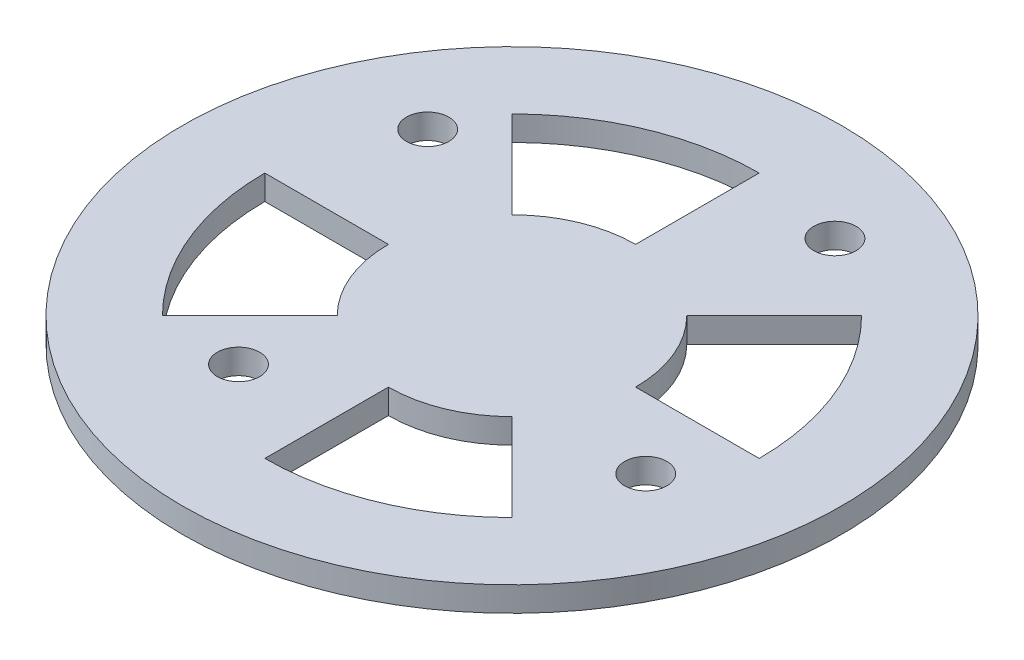
ISO-10303-21;
HEADER;
FILE_DESCRIPTION(('STEP AP214'),'2;1');
FILE_NAME('part.step','',(''),(''),'','','');
FILE_SCHEMA(('AUTOMOTIVE_DESIGN { 1 0 10303 214 1 1 1 1 }'));
ENDSEC;
DATA;
#1=APPLICATION_CONTEXT('core data for automotive mechanical design processes');
#2=APPLICATION_PROTOCOL_DEFINITION('international standard','automotive_design',2000,#1);
#3=PRODUCT_CONTEXT('',#1,'mechanical');
#4=PRODUCT('Part','Part','',(#3));
#5=PRODUCT_RELATED_PRODUCT_CATEGORY('part','',(#4));
#6=PRODUCT_DEFINITION_FORMATION('','',#4);
#7=PRODUCT_DEFINITION_CONTEXT('part definition',#1,'design');
#8=PRODUCT_DEFINITION('design','',#6,#7);
#9=PRODUCT_DEFINITION_SHAPE('','',#8);
#10=(LENGTH_UNIT() NAMED_UNIT(*) SI_UNIT(.MILLI.,.METRE.));
#11=(NAMED_UNIT(*) PLANE_ANGLE_UNIT() SI_UNIT($,.RADIAN.));
#12=(NAMED_UNIT(*) SI_UNIT($,.STERADIAN.) SOLID_ANGLE_UNIT());
#13=UNCERTAINTY_MEASURE_WITH_UNIT(LENGTH_MEASURE(1.E-05),#10,'distance_accuracy_value','');
#14=(GEOMETRIC_REPRESENTATION_CONTEXT(3) GLOBAL_UNCERTAINTY_ASSIGNED_CONTEXT((#13)) GLOBAL_UNIT_ASSIGNED_CONTEXT((#10,
#11,#12)) REPRESENTATION_CONTEXT('',''));
#15=CARTESIAN_POINT('',(0.,0.,0.));
#16=DIRECTION('',(0.,0.,1.));
#17=DIRECTION('',(1.,0.,0.));
#18=AXIS2_PLACEMENT_3D('',#15,#16,#17);
#19=CARTESIAN_POINT('',(0.,0.,0.));
#20=DIRECTION('',(0.,1.,0.));
#21=DIRECTION('',(0.,0.,1.));
#22=AXIS2_PLACEMENT_3D('',#19,#20,#21);
#23=PLANE('',#22);
#24=CARTESIAN_POINT('',(14.5802387731097,0.,-35.1998101886801));
#25=DIRECTION('',(0.,1.,0.));
#26=DIRECTION('',(0.,0.,1.));
#27=AXIS2_PLACEMENT_3D('',#24,#25,#26);
#28=CIRCLE('',#27,3.2639);
#29=CARTESIAN_POINT('',(14.5802387731097,0.,-31.9359101886801));
#30=VERTEX_POINT('',#29);
#31=EDGE_CURVE('E249',#30,#30,#28,.T.);
#32=ORIENTED_EDGE('',*,*,#31,.T.);
#33=EDGE_LOOP('',(#32));
#34=FACE_BOUND('',#33,.T.);
#35=CARTESIAN_POINT('',(31.3898101886813,0.,10.7702387731094));
#36=DIRECTION('',(0.,1.,0.));
#37=DIRECTION('',(0.,0.,1.));
#38=AXIS2_PLACEMENT_3D('',#35,#36,#37);
#39=CIRCLE('',#38,3.2639);
#40=CARTESIAN_POINT('',(31.3898101886813,0.,14.0341387731094));
#41=VERTEX_POINT('',#40);
#42=EDGE_CURVE('E262',#41,#41,#39,.T.);
#43=ORIENTED_EDGE('',*,*,#42,.T.);
#44=EDGE_LOOP('',(#43));
#45=FACE_BOUND('',#44,.T.);
#46=CARTESIAN_POINT('',(-14.5802387731082,0.,27.5798101886808));
#47=DIRECTION('',(0.,1.,0.));
#48=DIRECTION('',(0.,0.,1.));
#49=AXIS2_PLACEMENT_3D('',#46,#47,#48);
#50=CIRCLE('',#49,3.2639);
#51=CARTESIAN_POINT('',(-14.5802387731082,0.,30.8437101886808));
#52=VERTEX_POINT('',#51);
#53=EDGE_CURVE('E270',#52,#52,#50,.T.);
#54=ORIENTED_EDGE('',*,*,#53,.T.);
#55=EDGE_LOOP('',(#54));
#56=FACE_BOUND('',#55,.T.);
#57=CARTESIAN_POINT('',(-31.3898101886795,0.,-18.3902387731088));
#58=DIRECTION('',(0.,1.,0.));
#59=DIRECTION('',(0.,0.,1.));
#60=AXIS2_PLACEMENT_3D('',#57,#58,#59);
#61=CIRCLE('',#60,3.2639);
#62=CARTESIAN_POINT('',(-31.3898101886795,0.,-15.1263387731088));
#63=VERTEX_POINT('',#62);
#64=EDGE_CURVE('E238',#63,#63,#61,.T.);
#65=ORIENTED_EDGE('',*,*,#64,.T.);
#66=EDGE_LOOP('',(#65));
#67=FACE_BOUND('',#66,.T.);
#68=CARTESIAN_POINT('',(0.,0.,0.));
#69=DIRECTION('',(0.,1.,0.));
#70=DIRECTION('',(0.,0.,1.));
#71=AXIS2_PLACEMENT_3D('',#68,#69,#70);
#72=CIRCLE('',#71,19.05);
#73=CARTESIAN_POINT('',(-1.33025439009923E-13,0.,19.05));
#74=VERTEX_POINT('',#73);
#75=CARTESIAN_POINT('',(13.4703841816037,0.,13.4703841816038));
#76=VERTEX_POINT('',#75);
#77=EDGE_CURVE('E307',#74,#76,#72,.T.);
#78=ORIENTED_EDGE('',*,*,#77,.F.);
#79=DIRECTION('',(0.,0.,1.));
#80=VECTOR('',#79,1.);
#81=CARTESIAN_POINT('',(0.,0.,0.));
#82=LINE('',#81,#80);
#83=CARTESIAN_POINT('',(-2.66050878019847E-13,0.,38.1));
#84=VERTEX_POINT('',#83);
#85=EDGE_CURVE('E310',#74,#84,#82,.T.);
#86=ORIENTED_EDGE('',*,*,#85,.T.);
#87=CARTESIAN_POINT('',(0.,0.,0.));
#88=DIRECTION('',(0.,1.,0.));
#89=DIRECTION('',(0.,0.,1.));
#90=AXIS2_PLACEMENT_3D('',#87,#88,#89);
#91=CIRCLE('',#90,38.1);
#92=CARTESIAN_POINT('',(26.9407683632073,0.,26.9407683632076));
#93=VERTEX_POINT('',#92);
#94=EDGE_CURVE('E314',#84,#93,#91,.T.);
#95=ORIENTED_EDGE('',*,*,#94,.T.);
#96=DIRECTION('',(0.707106781186544,0.,0.707106781186551));
#97=VECTOR('',#96,1.);
#98=CARTESIAN_POINT('',(0.,0.,0.));
#99=LINE('',#98,#97);
#100=EDGE_CURVE('E318',#76,#93,#99,.T.);
#101=ORIENTED_EDGE('',*,*,#100,.F.);
#102=EDGE_LOOP('',(#78,#86,#95,#101));
#103=FACE_BOUND('',#102,.T.);
#104=CARTESIAN_POINT('',(0.,0.,0.));
#105=DIRECTION('',(0.,1.,0.));
#106=DIRECTION('',(0.,0.,1.));
#107=AXIS2_PLACEMENT_3D('',#104,#105,#106);
#108=CIRCLE('',#107,19.05);
#109=CARTESIAN_POINT('',(0.,0.,-19.05));
#110=VERTEX_POINT('',#109);
#111=CARTESIAN_POINT('',(-13.4703841816036,0.,-13.4703841816039));
#112=VERTEX_POINT('',#111);
#113=EDGE_CURVE('E197',#110,#112,#108,.T.);
#114=ORIENTED_EDGE('',*,*,#113,.F.);
#115=DIRECTION('',(0.,0.,-1.));
#116=VECTOR('',#115,1.);
#117=CARTESIAN_POINT('',(0.,0.,0.));
#118=LINE('',#117,#116);
#119=CARTESIAN_POINT('',(0.,0.,-38.1));
#120=VERTEX_POINT('',#119);
#121=EDGE_CURVE('E200',#110,#120,#118,.T.);
#122=ORIENTED_EDGE('',*,*,#121,.T.);
#123=CARTESIAN_POINT('',(0.,0.,0.));
#124=DIRECTION('',(0.,1.,0.));
#125=DIRECTION('',(0.,0.,1.));
#126=AXIS2_PLACEMENT_3D('',#123,#124,#125);
#127=CIRCLE('',#126,38.1);
#128=CARTESIAN_POINT('',(-26.9407683632071,0.,-26.9407683632078));
#129=VERTEX_POINT('',#128);
#130=EDGE_CURVE('E205',#120,#129,#127,.T.);
#131=ORIENTED_EDGE('',*,*,#130,.T.);
#132=DIRECTION('',(-0.707106781186539,0.,-0.707106781186556));
#133=VECTOR('',#132,1.);
#134=CARTESIAN_POINT('',(0.,0.,0.));
#135=LINE('',#134,#133);
#136=EDGE_CURVE('E209',#112,#129,#135,.T.);
#137=ORIENTED_EDGE('',*,*,#136,.F.);
#138=EDGE_LOOP('',(#114,#122,#131,#137));
#139=FACE_BOUND('',#138,.T.);
#140=CARTESIAN_POINT('',(0.,0.,0.));
#141=DIRECTION('',(0.,1.,0.));
#142=DIRECTION('',(0.,0.,1.));
#143=AXIS2_PLACEMENT_3D('',#140,#141,#142);
#144=CIRCLE('',#143,50.8);
#145=CARTESIAN_POINT('',(0.,0.,-50.8));
#146=VERTEX_POINT('',#145);
#147=EDGE_CURVE('E11',#146,#146,#144,.T.);
#148=ORIENTED_EDGE('',*,*,#147,.F.);
#149=EDGE_LOOP('',(#148));
#150=FACE_BOUND('',#149,.T.);
#151=CARTESIAN_POINT('',(0.,0.,0.));
#152=DIRECTION('',(0.,1.,0.));
#153=DIRECTION('',(0.,0.,1.));
#154=AXIS2_PLACEMENT_3D('',#151,#152,#153);
#155=CIRCLE('',#154,19.05);
#156=CARTESIAN_POINT('',(19.05,0.,0.));
#157=VERTEX_POINT('',#156);
#158=CARTESIAN_POINT('',(13.4703841816038,0.,-13.4703841816037));
#159=VERTEX_POINT('',#158);
#160=EDGE_CURVE('E277',#157,#159,#155,.T.);
#161=ORIENTED_EDGE('',*,*,#160,.F.);
#162=DIRECTION('',(1.,0.,0.));
#163=VECTOR('',#162,1.);
#164=CARTESIAN_POINT('',(0.,0.,0.));
#165=LINE('',#164,#163);
#166=CARTESIAN_POINT('',(38.1,0.,1.33025439009923E-13));
#167=VERTEX_POINT('',#166);
#168=EDGE_CURVE('E280',#157,#167,#165,.T.);
#169=ORIENTED_EDGE('',*,*,#168,.T.);
#170=CARTESIAN_POINT('',(0.,0.,0.));
#171=DIRECTION('',(0.,1.,0.));
#172=DIRECTION('',(0.,0.,1.));
#173=AXIS2_PLACEMENT_3D('',#170,#171,#172);
#174=CIRCLE('',#173,38.1);
#175=CARTESIAN_POINT('',(26.9407683632075,0.,-26.9407683632074));
#176=VERTEX_POINT('',#175);
#177=EDGE_CURVE('E285',#167,#176,#174,.T.);
#178=ORIENTED_EDGE('',*,*,#177,.T.);
#179=DIRECTION('',(0.707106781186549,0.,-0.707106781186546));
#180=VECTOR('',#179,1.);
#181=CARTESIAN_POINT('',(0.,0.,0.));
#182=LINE('',#181,#180);
#183=EDGE_CURVE('E289',#159,#176,#182,.T.);
#184=ORIENTED_EDGE('',*,*,#183,.F.);
#185=EDGE_LOOP('',(#161,#169,#178,#184));
#186=FACE_BOUND('',#185,.T.);
#187=CARTESIAN_POINT('',(0.,0.,0.));
#188=DIRECTION('',(0.,1.,0.));
#189=DIRECTION('',(0.,0.,1.));
#190=AXIS2_PLACEMENT_3D('',#187,#188,#189);
#191=CIRCLE('',#190,19.05);
#192=CARTESIAN_POINT('',(-19.05,0.,-1.99538158514885E-13));
#193=VERTEX_POINT('',#192);
#194=CARTESIAN_POINT('',(-13.4703841816038,0.,13.4703841816036));
#195=VERTEX_POINT('',#194);
#196=EDGE_CURVE('E253',#193,#195,#191,.T.);
#197=ORIENTED_EDGE('',*,*,#196,.F.);
#198=DIRECTION('',(-1.,0.,0.));
#199=VECTOR('',#198,1.);
#200=CARTESIAN_POINT('',(0.,0.,0.));
#201=LINE('',#200,#199);
#202=CARTESIAN_POINT('',(-38.1,0.,-3.9907631702977E-13));
#203=VERTEX_POINT('',#202);
#204=EDGE_CURVE('E183',#193,#203,#201,.T.);
#205=ORIENTED_EDGE('',*,*,#204,.T.);
#206=CARTESIAN_POINT('',(0.,0.,0.));
#207=DIRECTION('',(0.,1.,0.));
#208=DIRECTION('',(0.,0.,1.));
#209=AXIS2_PLACEMENT_3D('',#206,#207,#208);
#210=CIRCLE('',#209,38.1);
#211=CARTESIAN_POINT('',(-26.9407683632077,0.,26.9407683632072));
#212=VERTEX_POINT('',#211);
#213=EDGE_CURVE('E193',#203,#212,#210,.T.);
#214=ORIENTED_EDGE('',*,*,#213,.T.);
#215=DIRECTION('',(-0.707106781186554,0.,0.707106781186541));
#216=VECTOR('',#215,1.);
#217=CARTESIAN_POINT('',(0.,0.,0.));
#218=LINE('',#217,#216);
#219=EDGE_CURVE('E187',#195,#212,#218,.T.);
#220=ORIENTED_EDGE('',*,*,#219,.F.);
#221=EDGE_LOOP('',(#197,#205,#214,#220));
#222=FACE_BOUND('',#221,.T.);
#223=ADVANCED_FACE('F43',(#34,#45,#56,#67,#103,#139,#150,#186,#222),#23,.F.);
#224=CARTESIAN_POINT('',(0.,19.05,0.));
#225=DIRECTION('',(0.,-1.,0.));
#226=DIRECTION('',(0.,0.,-1.));
#227=AXIS2_PLACEMENT_3D('',#224,#225,#226);
#228=CYLINDRICAL_SURFACE('',#227,50.8);
#229=CARTESIAN_POINT('',(0.,3.81000000000001,0.));
#230=DIRECTION('',(0.,-1.,0.));
#231=DIRECTION('',(0.,0.,-1.));
#232=AXIS2_PLACEMENT_3D('',#229,#230,#231);
#233=CIRCLE('',#232,50.8);
#234=CARTESIAN_POINT('',(0.,3.81000000000001,-50.8));
#235=VERTEX_POINT('',#234);
#236=EDGE_CURVE('E168',#235,#235,#233,.F.);
#237=CARTESIAN_POINT('',(0.,3.81000000000001,-50.8));
#238=CARTESIAN_POINT('',(0.,3.77031250000001,-50.8));
#239=CARTESIAN_POINT('',(0.,3.73062500000001,-50.8));
#240=CARTESIAN_POINT('',(0.,3.65125000000001,-50.8));
#241=CARTESIAN_POINT('',(0.,3.61156250000001,-50.8));
#242=CARTESIAN_POINT('',(0.,3.53218750000001,-50.8));
#243=CARTESIAN_POINT('',(0.,3.49250000000001,-50.8));
#244=CARTESIAN_POINT('',(0.,3.41312500000001,-50.8));
#245=CARTESIAN_POINT('',(0.,3.37343750000001,-50.8));
#246=CARTESIAN_POINT('',(0.,3.29406250000001,-50.8));
#247=CARTESIAN_POINT('',(0.,3.25437500000001,-50.8));
#248=CARTESIAN_POINT('',(0.,3.17500000000001,-50.8));
#249=CARTESIAN_POINT('',(0.,3.13531250000001,-50.8));
#250=CARTESIAN_POINT('',(0.,3.05593750000001,-50.8));
#251=CARTESIAN_POINT('',(0.,3.01625000000001,-50.8));
#252=CARTESIAN_POINT('',(0.,2.93687500000001,-50.8));
#253=CARTESIAN_POINT('',(0.,2.89718750000001,-50.8));
#254=CARTESIAN_POINT('',(0.,2.81781250000001,-50.8));
#255=CARTESIAN_POINT('',(0.,2.77812500000001,-50.8));
#256=CARTESIAN_POINT('',(0.,2.69875000000001,-50.8));
#257=CARTESIAN_POINT('',(0.,2.65906250000001,-50.8));
#258=CARTESIAN_POINT('',(0.,2.57968750000001,-50.8));
#259=CARTESIAN_POINT('',(0.,2.54000000000001,-50.8));
#260=CARTESIAN_POINT('',(0.,2.46062500000001,-50.8));
#261=CARTESIAN_POINT('',(0.,2.42093750000001,-50.8));
#262=CARTESIAN_POINT('',(0.,2.34156250000001,-50.8));
#263=CARTESIAN_POINT('',(0.,2.30187500000001,-50.8));
#264=CARTESIAN_POINT('',(0.,2.22250000000001,-50.8));
#265=CARTESIAN_POINT('',(0.,2.18281250000001,-50.8));
#266=CARTESIAN_POINT('',(0.,2.10343750000001,-50.8));
#267=CARTESIAN_POINT('',(0.,2.06375000000001,-50.8));
#268=CARTESIAN_POINT('',(0.,1.98437500000001,-50.8));
#269=CARTESIAN_POINT('',(0.,1.9446875,-50.8));
#270=CARTESIAN_POINT('',(0.,1.8653125,-50.8));
#271=CARTESIAN_POINT('',(0.,1.825625,-50.8));
#272=CARTESIAN_POINT('',(0.,1.74625,-50.8));
#273=CARTESIAN_POINT('',(0.,1.7065625,-50.8));
#274=CARTESIAN_POINT('',(0.,1.62718750000001,-50.8));
#275=CARTESIAN_POINT('',(0.,1.58750000000001,-50.8));
#276=CARTESIAN_POINT('',(0.,1.508125,-50.8));
#277=CARTESIAN_POINT('',(0.,1.4684375,-50.8));
#278=CARTESIAN_POINT('',(0.,1.3890625,-50.8));
#279=CARTESIAN_POINT('',(0.,1.349375,-50.8));
#280=CARTESIAN_POINT('',(0.,1.27,-50.8));
#281=CARTESIAN_POINT('',(0.,1.2303125,-50.8));
#282=CARTESIAN_POINT('',(0.,1.1509375,-50.8));
#283=CARTESIAN_POINT('',(0.,1.11125,-50.8));
#284=CARTESIAN_POINT('',(0.,1.031875,-50.8));
#285=CARTESIAN_POINT('',(0.,0.992187500000003,-50.8));
#286=CARTESIAN_POINT('',(0.,0.912812500000002,-50.8));
#287=CARTESIAN_POINT('',(0.,0.873125000000002,-50.8));
#288=CARTESIAN_POINT('',(0.,0.793750000000003,-50.8));
#289=CARTESIAN_POINT('',(0.,0.754062500000003,-50.8));
#290=CARTESIAN_POINT('',(0.,0.674687500000002,-50.8));
#291=CARTESIAN_POINT('',(0.,0.635000000000001,-50.8));
#292=CARTESIAN_POINT('',(0.,0.555625000000001,-50.8));
#293=CARTESIAN_POINT('',(0.,0.515937500000001,-50.8));
#294=CARTESIAN_POINT('',(0.,0.436562500000001,-50.8));
#295=CARTESIAN_POINT('',(0.,0.396875000000001,-50.8));
#296=CARTESIAN_POINT('',(0.,0.317500000000001,-50.8));
#297=CARTESIAN_POINT('',(0.,0.2778125,-50.8));
#298=CARTESIAN_POINT('',(0.,0.198437499999999,-50.8));
#299=CARTESIAN_POINT('',(0.,0.158749999999999,-50.8));
#300=CARTESIAN_POINT('',(0.,0.0793749999999996,-50.8));
#301=CARTESIAN_POINT('',(0.,0.0396874999999998,-50.8));
#302=CARTESIAN_POINT('',(0.,0.,-50.8));
#303=B_SPLINE_CURVE_WITH_KNOTS('',3,(#237,#238,#239,#240,#241,#242,#243,#244,#245,#246,#247,
#248,#249,#250,#251,#252,#253,#254,#255,#256,#257,#258,#259,#260,#261,#262,#263,#264,#265,#266,
#267,#268,#269,#270,#271,#272,#273,#274,#275,#276,#277,#278,#279,#280,#281,#282,#283,#284,#285,
#286,#287,#288,#289,#290,#291,#292,#293,#294,#295,#296,#297,#298,#299,#300,#301,#302),
.UNSPECIFIED.,.F.,.F.,(4,2,2,2,2,2,2,2,2,2,2,2,2,2,2,2,2,2,2,2,2,2,2,2,2,2,2,2,2,2,2,2,4),(0.,
0.119062500000001,0.238125,0.357187500000002,0.476249999999999,0.595312499999999,
0.714375000000001,0.833437500000001,0.9525,1.0715625,1.190625,1.3096875,1.42875,1.5478125,
1.666875,1.7859375,1.90500000000001,2.02406250000001,2.143125,2.2621875,2.38125000000001,
2.50031250000001,2.61937500000001,2.7384375,2.85750000000001,2.97656250000001,3.09562500000001,
3.21468750000001,3.33375000000001,3.45281250000001,3.57187500000001,3.69093750000001,
3.81000000000001),.UNSPECIFIED.);
#304=EDGE_CURVE('BSEAM45',#235,#146,#303,.T.);
#305=ORIENTED_EDGE('',*,*,#236,.F.);
#306=ORIENTED_EDGE('',*,*,#147,.T.);
#307=ORIENTED_EDGE('',*,*,#304,.T.);
#308=ORIENTED_EDGE('',*,*,#304,.F.);
#309=EDGE_LOOP('',(#305,#307,#306,#308));
#310=FACE_BOUND('',#309,.T.);
#311=ADVANCED_FACE('F45',(#310),#228,.T.);
#312=CARTESIAN_POINT('',(0.,3.81,0.));
#313=DIRECTION('',(0.,-1.,0.));
#314=DIRECTION('',(0.,0.,-1.));
#315=AXIS2_PLACEMENT_3D('',#312,#313,#314);
#316=PLANE('',#315);
#317=CARTESIAN_POINT('',(14.5802387731097,3.81,-35.1998101886801));
#318=DIRECTION('',(0.,1.,0.));
#319=DIRECTION('',(0.,0.,1.));
#320=AXIS2_PLACEMENT_3D('',#317,#318,#319);
#321=CIRCLE('',#320,3.2639);
#322=CARTESIAN_POINT('',(14.5802387731097,3.81,-31.9359101886801));
#323=VERTEX_POINT('',#322);
#324=EDGE_CURVE('E254',#323,#323,#321,.T.);
#325=ORIENTED_EDGE('',*,*,#324,.F.);
#326=EDGE_LOOP('',(#325));
#327=FACE_BOUND('',#326,.T.);
#328=CARTESIAN_POINT('',(31.3898101886813,3.81,10.7702387731094));
#329=DIRECTION('',(0.,1.,0.));
#330=DIRECTION('',(0.,0.,1.));
#331=AXIS2_PLACEMENT_3D('',#328,#329,#330);
#332=CIRCLE('',#331,3.2639);
#333=CARTESIAN_POINT('',(31.3898101886813,3.81,14.0341387731094));
#334=VERTEX_POINT('',#333);
#335=EDGE_CURVE('E258',#334,#334,#332,.T.);
#336=ORIENTED_EDGE('',*,*,#335,.F.);
#337=EDGE_LOOP('',(#336));
#338=FACE_BOUND('',#337,.T.);
#339=CARTESIAN_POINT('',(-14.5802387731082,3.81,27.5798101886808));
#340=DIRECTION('',(0.,1.,0.));
#341=DIRECTION('',(0.,0.,1.));
#342=AXIS2_PLACEMENT_3D('',#339,#340,#341);
#343=CIRCLE('',#342,3.2639);
#344=CARTESIAN_POINT('',(-14.5802387731082,3.81,30.8437101886808));
#345=VERTEX_POINT('',#344);
#346=EDGE_CURVE('E266',#345,#345,#343,.T.);
#347=ORIENTED_EDGE('',*,*,#346,.F.);
#348=EDGE_LOOP('',(#347));
#349=FACE_BOUND('',#348,.T.);
#350=CARTESIAN_POINT('',(-31.3898101886795,3.81,-18.3902387731088));
#351=DIRECTION('',(0.,1.,0.));
#352=DIRECTION('',(0.,0.,1.));
#353=AXIS2_PLACEMENT_3D('',#350,#351,#352);
#354=CIRCLE('',#353,3.2639);
#355=CARTESIAN_POINT('',(-31.3898101886795,3.81,-15.1263387731088));
#356=VERTEX_POINT('',#355);
#357=EDGE_CURVE('E244',#356,#356,#354,.T.);
#358=ORIENTED_EDGE('',*,*,#357,.F.);
#359=EDGE_LOOP('',(#358));
#360=FACE_BOUND('',#359,.T.);
#361=ORIENTED_EDGE('',*,*,#236,.T.);
#362=EDGE_LOOP('',(#361));
#363=FACE_BOUND('',#362,.T.);
#364=CARTESIAN_POINT('',(0.,3.81,0.));
#365=DIRECTION('',(0.,-1.,0.));
#366=DIRECTION('',(0.,0.,-1.));
#367=AXIS2_PLACEMENT_3D('',#364,#365,#366);
#368=CIRCLE('',#367,19.05);
#369=CARTESIAN_POINT('',(-19.05,3.81,-1.99538158514885E-13));
#370=VERTEX_POINT('',#369);
#371=CARTESIAN_POINT('',(-13.4703841816038,3.81,13.4703841816036));
#372=VERTEX_POINT('',#371);
#373=EDGE_CURVE('E159',#370,#372,#368,.F.);
#374=ORIENTED_EDGE('',*,*,#373,.T.);
#375=DIRECTION('',(-0.707106781186554,0.,0.707106781186541));
#376=VECTOR('',#375,1.);
#377=CARTESIAN_POINT('',(0.,3.81,0.));
#378=LINE('',#377,#376);
#379=CARTESIAN_POINT('',(-26.9407683632077,3.81,26.9407683632072));
#380=VERTEX_POINT('',#379);
#381=EDGE_CURVE('E179',#372,#380,#378,.T.);
#382=ORIENTED_EDGE('',*,*,#381,.T.);
#383=CARTESIAN_POINT('',(0.,3.81,0.));
#384=DIRECTION('',(0.,-1.,0.));
#385=DIRECTION('',(0.,0.,-1.));
#386=AXIS2_PLACEMENT_3D('',#383,#384,#385);
#387=CIRCLE('',#386,38.1);
#388=CARTESIAN_POINT('',(-38.1,3.81,-3.9907631702977E-13));
#389=VERTEX_POINT('',#388);
#390=EDGE_CURVE('E162',#389,#380,#387,.F.);
#391=ORIENTED_EDGE('',*,*,#390,.F.);
#392=DIRECTION('',(-1.,0.,0.));
#393=VECTOR('',#392,1.);
#394=CARTESIAN_POINT('',(0.,3.81,0.));
#395=LINE('',#394,#393);
#396=EDGE_CURVE('E156',#370,#389,#395,.T.);
#397=ORIENTED_EDGE('',*,*,#396,.F.);
#398=EDGE_LOOP('',(#374,#382,#391,#397));
#399=FACE_BOUND('',#398,.T.);
#400=CARTESIAN_POINT('',(0.,3.81,0.));
#401=DIRECTION('',(0.,-1.,0.));
#402=DIRECTION('',(0.,0.,-1.));
#403=AXIS2_PLACEMENT_3D('',#400,#401,#402);
#404=CIRCLE('',#403,19.05);
#405=CARTESIAN_POINT('',(19.05,3.81,0.));
#406=VERTEX_POINT('',#405);
#407=CARTESIAN_POINT('',(13.4703841816038,3.81,-13.4703841816037));
#408=VERTEX_POINT('',#407);
#409=EDGE_CURVE('E473',#406,#408,#404,.F.);
#410=ORIENTED_EDGE('',*,*,#409,.T.);
#411=DIRECTION('',(0.707106781186549,0.,-0.707106781186546));
#412=VECTOR('',#411,1.);
#413=CARTESIAN_POINT('',(0.,3.81,0.));
#414=LINE('',#413,#412);
#415=CARTESIAN_POINT('',(26.9407683632075,3.81,-26.9407683632074));
#416=VERTEX_POINT('',#415);
#417=EDGE_CURVE('E470',#408,#416,#414,.T.);
#418=ORIENTED_EDGE('',*,*,#417,.T.);
#419=CARTESIAN_POINT('',(0.,3.81,0.));
#420=DIRECTION('',(0.,-1.,0.));
#421=DIRECTION('',(0.,0.,-1.));
#422=AXIS2_PLACEMENT_3D('',#419,#420,#421);
#423=CIRCLE('',#422,38.1);
#424=CARTESIAN_POINT('',(38.1,3.81,1.33025439009923E-13));
#425=VERTEX_POINT('',#424);
#426=EDGE_CURVE('E67',#425,#416,#423,.F.);
#427=ORIENTED_EDGE('',*,*,#426,.F.);
#428=DIRECTION('',(1.,0.,0.));
#429=VECTOR('',#428,1.);
#430=CARTESIAN_POINT('',(0.,3.81,0.));
#431=LINE('',#430,#429);
#432=EDGE_CURVE('E465',#406,#425,#431,.T.);
#433=ORIENTED_EDGE('',*,*,#432,.F.);
#434=EDGE_LOOP('',(#410,#418,#427,#433));
#435=FACE_BOUND('',#434,.T.);
#436=CARTESIAN_POINT('',(0.,3.81,0.));
#437=DIRECTION('',(0.,-1.,0.));
#438=DIRECTION('',(0.,0.,-1.));
#439=AXIS2_PLACEMENT_3D('',#436,#437,#438);
#440=CIRCLE('',#439,19.05);
#441=CARTESIAN_POINT('',(0.,3.81,-19.05));
#442=VERTEX_POINT('',#441);
#443=CARTESIAN_POINT('',(-13.4703841816036,3.81,-13.4703841816039));
#444=VERTEX_POINT('',#443);
#445=EDGE_CURVE('E235',#442,#444,#440,.F.);
#446=ORIENTED_EDGE('',*,*,#445,.T.);
#447=DIRECTION('',(-0.707106781186539,0.,-0.707106781186556));
#448=VECTOR('',#447,1.);
#449=CARTESIAN_POINT('',(0.,3.81,0.));
#450=LINE('',#449,#448);
#451=CARTESIAN_POINT('',(-26.9407683632071,3.81,-26.9407683632078));
#452=VERTEX_POINT('',#451);
#453=EDGE_CURVE('E239',#444,#452,#450,.T.);
#454=ORIENTED_EDGE('',*,*,#453,.T.);
#455=CARTESIAN_POINT('',(0.,3.81,0.));
#456=DIRECTION('',(0.,-1.,0.));
#457=DIRECTION('',(0.,0.,-1.));
#458=AXIS2_PLACEMENT_3D('',#455,#456,#457);
#459=CIRCLE('',#458,38.1);
#460=CARTESIAN_POINT('',(0.,3.81,-38.1));
#461=VERTEX_POINT('',#460);
#462=EDGE_CURVE('E59',#461,#452,#459,.F.);
#463=ORIENTED_EDGE('',*,*,#462,.F.);
#464=DIRECTION('',(0.,0.,-1.));
#465=VECTOR('',#464,1.);
#466=CARTESIAN_POINT('',(0.,3.81,0.));
#467=LINE('',#466,#465);
#468=EDGE_CURVE('E229',#442,#461,#467,.T.);
#469=ORIENTED_EDGE('',*,*,#468,.F.);
#470=EDGE_LOOP('',(#446,#454,#463,#469));
#471=FACE_BOUND('',#470,.T.);
#472=CARTESIAN_POINT('',(0.,3.81,0.));
#473=DIRECTION('',(0.,-1.,0.));
#474=DIRECTION('',(0.,0.,-1.));
#475=AXIS2_PLACEMENT_3D('',#472,#473,#474);
#476=CIRCLE('',#475,19.05);
#477=CARTESIAN_POINT('',(-1.33025439009923E-13,3.81,19.05));
#478=VERTEX_POINT('',#477);
#479=CARTESIAN_POINT('',(13.4703841816037,3.81,13.4703841816038));
#480=VERTEX_POINT('',#479);
#481=EDGE_CURVE('E462',#478,#480,#476,.F.);
#482=ORIENTED_EDGE('',*,*,#481,.T.);
#483=DIRECTION('',(0.707106781186544,0.,0.707106781186551));
#484=VECTOR('',#483,1.);
#485=CARTESIAN_POINT('',(0.,3.81,0.));
#486=LINE('',#485,#484);
#487=CARTESIAN_POINT('',(26.9407683632073,3.81,26.9407683632076));
#488=VERTEX_POINT('',#487);
#489=EDGE_CURVE('E459',#480,#488,#486,.T.);
#490=ORIENTED_EDGE('',*,*,#489,.T.);
#491=CARTESIAN_POINT('',(0.,3.81,0.));
#492=DIRECTION('',(0.,-1.,0.));
#493=DIRECTION('',(0.,0.,-1.));
#494=AXIS2_PLACEMENT_3D('',#491,#492,#493);
#495=CIRCLE('',#494,38.1);
#496=CARTESIAN_POINT('',(-2.66050878019847E-13,3.81,38.1));
#497=VERTEX_POINT('',#496);
#498=EDGE_CURVE('E455',#497,#488,#495,.F.);
#499=ORIENTED_EDGE('',*,*,#498,.F.);
#500=DIRECTION('',(0.,0.,1.));
#501=VECTOR('',#500,1.);
#502=CARTESIAN_POINT('',(0.,3.81,0.));
#503=LINE('',#502,#501);
#504=EDGE_CURVE('E178',#478,#497,#503,.T.);
#505=ORIENTED_EDGE('',*,*,#504,.F.);
#506=EDGE_LOOP('',(#482,#490,#499,#505));
#507=FACE_BOUND('',#506,.T.);
#508=ADVANCED_FACE('F158',(#327,#338,#349,#360,#363,#399,#435,#471,#507),#316,.F.);
#509=CARTESIAN_POINT('',(0.,0.,0.));
#510=DIRECTION('',(0.,1.,0.));
#511=DIRECTION('',(0.,0.,1.));
#512=AXIS2_PLACEMENT_3D('',#509,#510,#511);
#513=CYLINDRICAL_SURFACE('',#512,19.05);
#514=ORIENTED_EDGE('',*,*,#445,.F.);
#515=DIRECTION('',(0.,1.,0.));
#516=VECTOR('',#515,1.);
#517=CARTESIAN_POINT('',(0.,0.,-19.05));
#518=LINE('',#517,#516);
#519=EDGE_CURVE('E212',#110,#442,#518,.T.);
#520=ORIENTED_EDGE('',*,*,#519,.F.);
#521=ORIENTED_EDGE('',*,*,#113,.T.);
#522=DIRECTION('',(0.,1.,0.));
#523=VECTOR('',#522,1.);
#524=CARTESIAN_POINT('',(-13.4703841816036,0.,-13.4703841816039));
#525=LINE('',#524,#523);
#526=EDGE_CURVE('E52',#112,#444,#525,.T.);
#527=ORIENTED_EDGE('',*,*,#526,.T.);
#528=EDGE_LOOP('',(#514,#520,#521,#527));
#529=FACE_BOUND('',#528,.T.);
#530=ADVANCED_FACE('F233',(#529),#513,.T.);
#531=CARTESIAN_POINT('',(0.,0.,0.));
#532=DIRECTION('',(0.707106781186556,0.,-0.707106781186539));
#533=DIRECTION('',(-0.707106781186539,0.,-0.707106781186556));
#534=AXIS2_PLACEMENT_3D('',#531,#532,#533);
#535=PLANE('',#534);
#536=ORIENTED_EDGE('',*,*,#453,.F.);
#537=ORIENTED_EDGE('',*,*,#526,.F.);
#538=ORIENTED_EDGE('',*,*,#136,.T.);
#539=DIRECTION('',(0.,1.,0.));
#540=VECTOR('',#539,1.);
#541=CARTESIAN_POINT('',(-26.9407683632071,0.,-26.9407683632078));
#542=LINE('',#541,#540);
#543=EDGE_CURVE('E216',#129,#452,#542,.T.);
#544=ORIENTED_EDGE('',*,*,#543,.T.);
#545=EDGE_LOOP('',(#536,#537,#538,#544));
#546=FACE_BOUND('',#545,.T.);
#547=ADVANCED_FACE('F366',(#546),#535,.T.);
#548=CARTESIAN_POINT('',(0.,0.,0.));
#549=DIRECTION('',(0.,1.,0.));
#550=DIRECTION('',(0.,0.,1.));
#551=AXIS2_PLACEMENT_3D('',#548,#549,#550);
#552=CYLINDRICAL_SURFACE('',#551,38.1);
#553=DIRECTION('',(0.,1.,0.));
#554=VECTOR('',#553,1.);
#555=CARTESIAN_POINT('',(0.,0.,-38.1));
#556=LINE('',#555,#554);
#557=EDGE_CURVE('E220',#120,#461,#556,.T.);
#558=ORIENTED_EDGE('',*,*,#557,.T.);
#559=ORIENTED_EDGE('',*,*,#462,.T.);
#560=ORIENTED_EDGE('',*,*,#543,.F.);
#561=ORIENTED_EDGE('',*,*,#130,.F.);
#562=EDGE_LOOP('',(#558,#559,#560,#561));
#563=FACE_BOUND('',#562,.T.);
#564=ADVANCED_FACE('F370',(#563),#552,.F.);
#565=CARTESIAN_POINT('',(0.,0.,0.));
#566=DIRECTION('',(1.,0.,0.));
#567=DIRECTION('',(0.,0.,-1.));
#568=AXIS2_PLACEMENT_3D('',#565,#566,#567);
#569=PLANE('',#568);
#570=ORIENTED_EDGE('',*,*,#519,.T.);
#571=ORIENTED_EDGE('',*,*,#468,.T.);
#572=ORIENTED_EDGE('',*,*,#557,.F.);
#573=ORIENTED_EDGE('',*,*,#121,.F.);
#574=EDGE_LOOP('',(#570,#571,#572,#573));
#575=FACE_BOUND('',#574,.T.);
#576=ADVANCED_FACE('F227',(#575),#569,.F.);
#577=CARTESIAN_POINT('',(0.,0.,0.));
#578=DIRECTION('',(0.,1.,0.));
#579=DIRECTION('',(0.,0.,1.));
#580=AXIS2_PLACEMENT_3D('',#577,#578,#579);
#581=CYLINDRICAL_SURFACE('',#580,19.05);
#582=ORIENTED_EDGE('',*,*,#409,.F.);
#583=DIRECTION('',(0.,1.,0.));
#584=VECTOR('',#583,1.);
#585=CARTESIAN_POINT('',(19.05,0.,0.));
#586=LINE('',#585,#584);
#587=EDGE_CURVE('E292',#157,#406,#586,.T.);
#588=ORIENTED_EDGE('',*,*,#587,.F.);
#589=ORIENTED_EDGE('',*,*,#160,.T.);
#590=DIRECTION('',(0.,1.,0.));
#591=VECTOR('',#590,1.);
#592=CARTESIAN_POINT('',(13.4703841816038,0.,-13.4703841816037));
#593=LINE('',#592,#591);
#594=EDGE_CURVE('E201',#159,#408,#593,.T.);
#595=ORIENTED_EDGE('',*,*,#594,.T.);
#596=EDGE_LOOP('',(#582,#588,#589,#595));
#597=FACE_BOUND('',#596,.T.);
#598=ADVANCED_FACE('F369',(#597),#581,.T.);
#599=CARTESIAN_POINT('',(0.,0.,0.));
#600=DIRECTION('',(0.707106781186546,0.,0.707106781186549));
#601=DIRECTION('',(0.707106781186549,0.,-0.707106781186546));
#602=AXIS2_PLACEMENT_3D('',#599,#600,#601);
#603=PLANE('',#602);
#604=ORIENTED_EDGE('',*,*,#417,.F.);
#605=ORIENTED_EDGE('',*,*,#594,.F.);
#606=ORIENTED_EDGE('',*,*,#183,.T.);
#607=DIRECTION('',(0.,1.,0.));
#608=VECTOR('',#607,1.);
#609=CARTESIAN_POINT('',(26.9407683632075,0.,-26.9407683632074));
#610=LINE('',#609,#608);
#611=EDGE_CURVE('E296',#176,#416,#610,.T.);
#612=ORIENTED_EDGE('',*,*,#611,.T.);
#613=EDGE_LOOP('',(#604,#605,#606,#612));
#614=FACE_BOUND('',#613,.T.);
#615=ADVANCED_FACE('F405',(#614),#603,.T.);
#616=CARTESIAN_POINT('',(0.,0.,0.));
#617=DIRECTION('',(0.,1.,0.));
#618=DIRECTION('',(0.,0.,1.));
#619=AXIS2_PLACEMENT_3D('',#616,#617,#618);
#620=CYLINDRICAL_SURFACE('',#619,38.1);
#621=DIRECTION('',(0.,1.,0.));
#622=VECTOR('',#621,1.);
#623=CARTESIAN_POINT('',(38.1,0.,1.33025439009923E-13));
#624=LINE('',#623,#622);
#625=EDGE_CURVE('E300',#167,#425,#624,.T.);
#626=ORIENTED_EDGE('',*,*,#625,.T.);
#627=ORIENTED_EDGE('',*,*,#426,.T.);
#628=ORIENTED_EDGE('',*,*,#611,.F.);
#629=ORIENTED_EDGE('',*,*,#177,.F.);
#630=EDGE_LOOP('',(#626,#627,#628,#629));
#631=FACE_BOUND('',#630,.T.);
#632=ADVANCED_FACE('F409',(#631),#620,.F.);
#633=CARTESIAN_POINT('',(0.,0.,0.));
#634=DIRECTION('',(0.,0.,1.));
#635=DIRECTION('',(1.,0.,0.));
#636=AXIS2_PLACEMENT_3D('',#633,#634,#635);
#637=PLANE('',#636);
#638=ORIENTED_EDGE('',*,*,#587,.T.);
#639=ORIENTED_EDGE('',*,*,#432,.T.);
#640=ORIENTED_EDGE('',*,*,#625,.F.);
#641=ORIENTED_EDGE('',*,*,#168,.F.);
#642=EDGE_LOOP('',(#638,#639,#640,#641));
#643=FACE_BOUND('',#642,.T.);
#644=ADVANCED_FACE('F391',(#643),#637,.F.);
#645=CARTESIAN_POINT('',(0.,0.,0.));
#646=DIRECTION('',(0.,1.,0.));
#647=DIRECTION('',(0.,0.,1.));
#648=AXIS2_PLACEMENT_3D('',#645,#646,#647);
#649=CYLINDRICAL_SURFACE('',#648,19.05);
#650=ORIENTED_EDGE('',*,*,#481,.F.);
#651=DIRECTION('',(0.,1.,0.));
#652=VECTOR('',#651,1.);
#653=CARTESIAN_POINT('',(-1.33025439009923E-13,0.,19.05));
#654=LINE('',#653,#652);
#655=EDGE_CURVE('E321',#74,#478,#654,.T.);
#656=ORIENTED_EDGE('',*,*,#655,.F.);
#657=ORIENTED_EDGE('',*,*,#77,.T.);
#658=DIRECTION('',(0.,1.,0.));
#659=VECTOR('',#658,1.);
#660=CARTESIAN_POINT('',(13.4703841816037,0.,13.4703841816038));
#661=LINE('',#660,#659);
#662=EDGE_CURVE('E281',#76,#480,#661,.T.);
#663=ORIENTED_EDGE('',*,*,#662,.T.);
#664=EDGE_LOOP('',(#650,#656,#657,#663));
#665=FACE_BOUND('',#664,.T.);
#666=ADVANCED_FACE('F387',(#665),#649,.T.);
#667=CARTESIAN_POINT('',(0.,0.,0.));
#668=DIRECTION('',(-0.707106781186551,0.,0.707106781186544));
#669=DIRECTION('',(0.707106781186544,0.,0.707106781186551));
#670=AXIS2_PLACEMENT_3D('',#667,#668,#669);
#671=PLANE('',#670);
#672=ORIENTED_EDGE('',*,*,#489,.F.);
#673=ORIENTED_EDGE('',*,*,#662,.F.);
#674=ORIENTED_EDGE('',*,*,#100,.T.);
#675=DIRECTION('',(0.,1.,0.));
#676=VECTOR('',#675,1.);
#677=CARTESIAN_POINT('',(26.9407683632073,0.,26.9407683632076));
#678=LINE('',#677,#676);
#679=EDGE_CURVE('E325',#93,#488,#678,.T.);
#680=ORIENTED_EDGE('',*,*,#679,.T.);
#681=EDGE_LOOP('',(#672,#673,#674,#680));
#682=FACE_BOUND('',#681,.T.);
#683=ADVANCED_FACE('F390',(#682),#671,.T.);
#684=CARTESIAN_POINT('',(0.,0.,0.));
#685=DIRECTION('',(0.,1.,0.));
#686=DIRECTION('',(0.,0.,1.));
#687=AXIS2_PLACEMENT_3D('',#684,#685,#686);
#688=CYLINDRICAL_SURFACE('',#687,38.1);
#689=DIRECTION('',(0.,1.,0.));
#690=VECTOR('',#689,1.);
#691=CARTESIAN_POINT('',(-2.66050878019847E-13,0.,38.1));
#692=LINE('',#691,#690);
#693=EDGE_CURVE('E329',#84,#497,#692,.T.);
#694=ORIENTED_EDGE('',*,*,#693,.T.);
#695=ORIENTED_EDGE('',*,*,#498,.T.);
#696=ORIENTED_EDGE('',*,*,#679,.F.);
#697=ORIENTED_EDGE('',*,*,#94,.F.);
#698=EDGE_LOOP('',(#694,#695,#696,#697));
#699=FACE_BOUND('',#698,.T.);
#700=ADVANCED_FACE('F395',(#699),#688,.F.);
#701=CARTESIAN_POINT('',(0.,0.,0.));
#702=DIRECTION('',(-1.,0.,0.));
#703=DIRECTION('',(0.,0.,1.));
#704=AXIS2_PLACEMENT_3D('',#701,#702,#703);
#705=PLANE('',#704);
#706=ORIENTED_EDGE('',*,*,#655,.T.);
#707=ORIENTED_EDGE('',*,*,#504,.T.);
#708=ORIENTED_EDGE('',*,*,#693,.F.);
#709=ORIENTED_EDGE('',*,*,#85,.F.);
#710=EDGE_LOOP('',(#706,#707,#708,#709));
#711=FACE_BOUND('',#710,.T.);
#712=ADVANCED_FACE('F379',(#711),#705,.F.);
#713=CARTESIAN_POINT('',(0.,0.,0.));
#714=DIRECTION('',(0.,1.,0.));
#715=DIRECTION('',(0.,0.,1.));
#716=AXIS2_PLACEMENT_3D('',#713,#714,#715);
#717=CYLINDRICAL_SURFACE('',#716,19.05);
#718=ORIENTED_EDGE('',*,*,#373,.F.);
#719=DIRECTION('',(0.,1.,0.));
#720=VECTOR('',#719,1.);
#721=CARTESIAN_POINT('',(-19.05,0.,-1.99538158514885E-13));
#722=LINE('',#721,#720);
#723=EDGE_CURVE('E173',#193,#370,#722,.T.);
#724=ORIENTED_EDGE('',*,*,#723,.F.);
#725=ORIENTED_EDGE('',*,*,#196,.T.);
#726=DIRECTION('',(0.,1.,0.));
#727=VECTOR('',#726,1.);
#728=CARTESIAN_POINT('',(-13.4703841816038,0.,13.4703841816036));
#729=LINE('',#728,#727);
#730=EDGE_CURVE('E176',#195,#372,#729,.T.);
#731=ORIENTED_EDGE('',*,*,#730,.T.);
#732=EDGE_LOOP('',(#718,#724,#725,#731));
#733=FACE_BOUND('',#732,.T.);
#734=ADVANCED_FACE('F172',(#733),#717,.T.);
#735=CARTESIAN_POINT('',(0.,0.,0.));
#736=DIRECTION('',(-0.707106781186541,0.,-0.707106781186554));
#737=DIRECTION('',(-0.707106781186554,0.,0.707106781186541));
#738=AXIS2_PLACEMENT_3D('',#735,#736,#737);
#739=PLANE('',#738);
#740=ORIENTED_EDGE('',*,*,#381,.F.);
#741=ORIENTED_EDGE('',*,*,#730,.F.);
#742=ORIENTED_EDGE('',*,*,#219,.T.);
#743=DIRECTION('',(0.,1.,0.));
#744=VECTOR('',#743,1.);
#745=CARTESIAN_POINT('',(-26.9407683632077,0.,26.9407683632072));
#746=LINE('',#745,#744);
#747=EDGE_CURVE('E191',#212,#380,#746,.T.);
#748=ORIENTED_EDGE('',*,*,#747,.T.);
#749=EDGE_LOOP('',(#740,#741,#742,#748));
#750=FACE_BOUND('',#749,.T.);
#751=ADVANCED_FACE('F348',(#750),#739,.T.);
#752=CARTESIAN_POINT('',(0.,0.,0.));
#753=DIRECTION('',(0.,1.,0.));
#754=DIRECTION('',(0.,0.,1.));
#755=AXIS2_PLACEMENT_3D('',#752,#753,#754);
#756=CYLINDRICAL_SURFACE('',#755,38.1);
#757=DIRECTION('',(0.,1.,0.));
#758=VECTOR('',#757,1.);
#759=CARTESIAN_POINT('',(-38.1,0.,-3.9907631702977E-13));
#760=LINE('',#759,#758);
#761=EDGE_CURVE('E186',#203,#389,#760,.T.);
#762=ORIENTED_EDGE('',*,*,#761,.T.);
#763=ORIENTED_EDGE('',*,*,#390,.T.);
#764=ORIENTED_EDGE('',*,*,#747,.F.);
#765=ORIENTED_EDGE('',*,*,#213,.F.);
#766=EDGE_LOOP('',(#762,#763,#764,#765));
#767=FACE_BOUND('',#766,.T.);
#768=ADVANCED_FACE('F351',(#767),#756,.F.);
#769=CARTESIAN_POINT('',(0.,0.,0.));
#770=DIRECTION('',(0.,0.,-1.));
#771=DIRECTION('',(-1.,0.,0.));
#772=AXIS2_PLACEMENT_3D('',#769,#770,#771);
#773=PLANE('',#772);
#774=ORIENTED_EDGE('',*,*,#723,.T.);
#775=ORIENTED_EDGE('',*,*,#396,.T.);
#776=ORIENTED_EDGE('',*,*,#761,.F.);
#777=ORIENTED_EDGE('',*,*,#204,.F.);
#778=EDGE_LOOP('',(#774,#775,#776,#777));
#779=FACE_BOUND('',#778,.T.);
#780=ADVANCED_FACE('F181',(#779),#773,.F.);
#781=CARTESIAN_POINT('',(-31.3898101886795,0.,-18.3902387731088));
#782=DIRECTION('',(0.,1.,0.));
#783=DIRECTION('',(0.,0.,1.));
#784=AXIS2_PLACEMENT_3D('',#781,#782,#783);
#785=CYLINDRICAL_SURFACE('',#784,3.2639);
#786=ORIENTED_EDGE('',*,*,#64,.F.);
#787=EDGE_LOOP('',(#786));
#788=FACE_BOUND('',#787,.T.);
#789=ORIENTED_EDGE('',*,*,#357,.T.);
#790=EDGE_LOOP('',(#789));
#791=FACE_BOUND('',#790,.T.);
#792=ADVANCED_FACE('F382',(#788,#791),#785,.F.);
#793=CARTESIAN_POINT('',(-14.5802387731082,0.,27.5798101886808));
#794=DIRECTION('',(0.,1.,0.));
#795=DIRECTION('',(0.,0.,1.));
#796=AXIS2_PLACEMENT_3D('',#793,#794,#795);
#797=CYLINDRICAL_SURFACE('',#796,3.2639);
#798=ORIENTED_EDGE('',*,*,#53,.F.);
#799=EDGE_LOOP('',(#798));
#800=FACE_BOUND('',#799,.T.);
#801=ORIENTED_EDGE('',*,*,#346,.T.);
#802=EDGE_LOOP('',(#801));
#803=FACE_BOUND('',#802,.T.);
#804=ADVANCED_FACE('F419',(#800,#803),#797,.F.);
#805=CARTESIAN_POINT('',(31.3898101886813,0.,10.7702387731094));
#806=DIRECTION('',(0.,1.,0.));
#807=DIRECTION('',(0.,0.,1.));
#808=AXIS2_PLACEMENT_3D('',#805,#806,#807);
#809=CYLINDRICAL_SURFACE('',#808,3.2639);
#810=ORIENTED_EDGE('',*,*,#42,.F.);
#811=EDGE_LOOP('',(#810));
#812=FACE_BOUND('',#811,.T.);
#813=ORIENTED_EDGE('',*,*,#335,.T.);
#814=EDGE_LOOP('',(#813));
#815=FACE_BOUND('',#814,.T.);
#816=ADVANCED_FACE('F423',(#812,#815),#809,.F.);
#817=CARTESIAN_POINT('',(14.5802387731097,0.,-35.1998101886801));
#818=DIRECTION('',(0.,1.,0.));
#819=DIRECTION('',(0.,0.,1.));
#820=AXIS2_PLACEMENT_3D('',#817,#818,#819);
#821=CYLINDRICAL_SURFACE('',#820,3.2639);
#822=ORIENTED_EDGE('',*,*,#31,.F.);
#823=EDGE_LOOP('',(#822));
#824=FACE_BOUND('',#823,.T.);
#825=ORIENTED_EDGE('',*,*,#324,.T.);
#826=EDGE_LOOP('',(#825));
#827=FACE_BOUND('',#826,.T.);
#828=ADVANCED_FACE('F427',(#824,#827),#821,.F.);
#829=CLOSED_SHELL('',(#223,#311,#508,#530,#547,#564,#576,#598,#615,#632,#644,#666,#683,#700,
#712,#734,#751,#768,#780,#792,#804,#816,#828));
#830=MANIFOLD_SOLID_BREP('B2',#829);
#831=ADVANCED_BREP_SHAPE_REPRESENTATION('',(#18,#830),#14);
#832=SHAPE_DEFINITION_REPRESENTATION(#9,#831);
ENDSEC;
END-ISO-10303-21;
